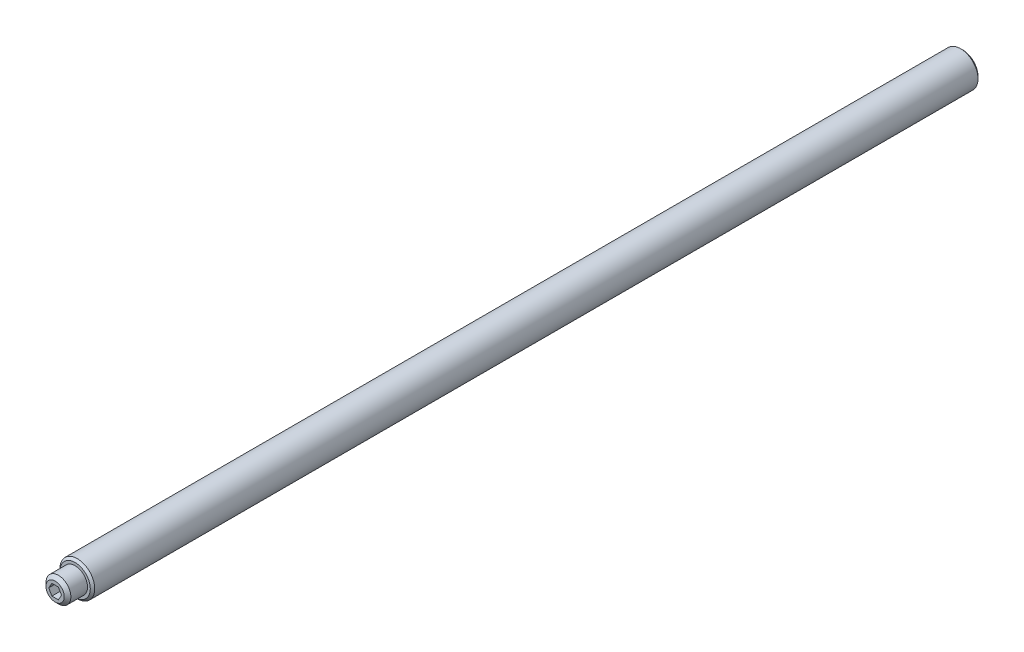
ISO-10303-21;
HEADER;
FILE_DESCRIPTION(('STEP AP214'),'2;1');
FILE_NAME('part.step','',(''),(''),'','','');
FILE_SCHEMA(('AUTOMOTIVE_DESIGN { 1 0 10303 214 1 1 1 1 }'));
ENDSEC;
DATA;
#1=APPLICATION_CONTEXT('core data for automotive mechanical design processes');
#2=APPLICATION_PROTOCOL_DEFINITION('international standard','automotive_design',2000,#1);
#3=PRODUCT_CONTEXT('',#1,'mechanical');
#4=PRODUCT('Part','Part','',(#3));
#5=PRODUCT_RELATED_PRODUCT_CATEGORY('part','',(#4));
#6=PRODUCT_DEFINITION_FORMATION('','',#4);
#7=PRODUCT_DEFINITION_CONTEXT('part definition',#1,'design');
#8=PRODUCT_DEFINITION('design','',#6,#7);
#9=PRODUCT_DEFINITION_SHAPE('','',#8);
#10=(LENGTH_UNIT() NAMED_UNIT(*) SI_UNIT(.MILLI.,.METRE.));
#11=(NAMED_UNIT(*) PLANE_ANGLE_UNIT() SI_UNIT($,.RADIAN.));
#12=(NAMED_UNIT(*) SI_UNIT($,.STERADIAN.) SOLID_ANGLE_UNIT());
#13=UNCERTAINTY_MEASURE_WITH_UNIT(LENGTH_MEASURE(1.E-05),#10,'distance_accuracy_value','');
#14=(GEOMETRIC_REPRESENTATION_CONTEXT(3) GLOBAL_UNCERTAINTY_ASSIGNED_CONTEXT((#13)) GLOBAL_UNIT_ASSIGNED_CONTEXT((#10,
#11,#12)) REPRESENTATION_CONTEXT('',''));
#15=CARTESIAN_POINT('',(0.,0.,0.));
#16=DIRECTION('',(0.,0.,1.));
#17=DIRECTION('',(1.,0.,0.));
#18=AXIS2_PLACEMENT_3D('',#15,#16,#17);
#19=CARTESIAN_POINT('',(0.,0.,50.8));
#20=DIRECTION('',(0.,0.,-1.));
#21=DIRECTION('',(-1.,0.,0.));
#22=AXIS2_PLACEMENT_3D('',#19,#20,#21);
#23=CYLINDRICAL_SURFACE('',#22,1.9939);
#24=CARTESIAN_POINT('',(0.,0.,-50.546));
#25=DIRECTION('',(0.,0.,1.));
#26=DIRECTION('',(1.,0.,0.));
#27=AXIS2_PLACEMENT_3D('',#24,#25,#26);
#28=CIRCLE('',#27,1.9939);
#29=CARTESIAN_POINT('',(1.9939,0.,-50.546));
#30=VERTEX_POINT('',#29);
#31=EDGE_CURVE('P0_E25',#30,#30,#28,.T.);
#32=ORIENTED_EDGE('',*,*,#31,.T.);
#33=EDGE_LOOP('',(#32));
#34=FACE_BOUND('',#33,.T.);
#35=CARTESIAN_POINT('',(0.,0.,50.546));
#36=DIRECTION('',(0.,0.,1.));
#37=DIRECTION('',(1.,0.,0.));
#38=AXIS2_PLACEMENT_3D('',#35,#36,#37);
#39=CIRCLE('',#38,1.9939);
#40=CARTESIAN_POINT('',(1.9939,0.,50.546));
#41=VERTEX_POINT('',#40);
#42=EDGE_CURVE('P0_E66',#41,#41,#39,.F.);
#43=ORIENTED_EDGE('',*,*,#42,.T.);
#44=EDGE_LOOP('',(#43));
#45=FACE_BOUND('',#44,.T.);
#46=ADVANCED_FACE('P0_F17',(#34,#45),#23,.T.);
#47=CARTESIAN_POINT('',(0.,0.,50.8));
#48=DIRECTION('',(0.,0.,1.));
#49=DIRECTION('',(1.,0.,0.));
#50=AXIS2_PLACEMENT_3D('',#47,#48,#49);
#51=PLANE('',#50);
#52=CARTESIAN_POINT('',(0.,0.,50.8));
#53=DIRECTION('',(0.,0.,1.));
#54=DIRECTION('',(1.,0.,0.));
#55=AXIS2_PLACEMENT_3D('',#52,#53,#54);
#56=CIRCLE('',#55,1.42239999999999);
#57=CARTESIAN_POINT('',(1.42239999999999,0.,50.8));
#58=VERTEX_POINT('',#57);
#59=EDGE_CURVE('P0_E60',#58,#58,#56,.T.);
#60=ORIENTED_EDGE('',*,*,#59,.F.);
#61=EDGE_LOOP('',(#60));
#62=FACE_BOUND('',#61,.T.);
#63=CARTESIAN_POINT('',(0.,0.,50.8));
#64=DIRECTION('',(0.,0.,1.));
#65=DIRECTION('',(1.,0.,0.));
#66=AXIS2_PLACEMENT_3D('',#63,#64,#65);
#67=CIRCLE('',#66,1.73989999999999);
#68=CARTESIAN_POINT('',(1.73989999999999,0.,50.8));
#69=VERTEX_POINT('',#68);
#70=EDGE_CURVE('P0_E63',#69,#69,#67,.T.);
#71=ORIENTED_EDGE('',*,*,#70,.T.);
#72=EDGE_LOOP('',(#71));
#73=FACE_BOUND('',#72,.T.);
#74=ADVANCED_FACE('P0_F89',(#62,#73),#51,.T.);
#75=CARTESIAN_POINT('',(0.,0.,-50.8));
#76=DIRECTION('',(0.,0.,1.));
#77=DIRECTION('',(1.,0.,0.));
#78=AXIS2_PLACEMENT_3D('',#75,#76,#77);
#79=PLANE('',#78);
#80=CARTESIAN_POINT('',(0.,0.,-50.8));
#81=DIRECTION('',(0.,0.,-1.));
#82=DIRECTION('',(-1.,0.,0.));
#83=AXIS2_PLACEMENT_3D('',#80,#81,#82);
#84=CIRCLE('',#83,1.42239999999999);
#85=CARTESIAN_POINT('',(-1.42239999999999,0.,-50.8));
#86=VERTEX_POINT('',#85);
#87=EDGE_CURVE('P0_E48',#86,#86,#84,.T.);
#88=ORIENTED_EDGE('',*,*,#87,.F.);
#89=EDGE_LOOP('',(#88));
#90=FACE_BOUND('',#89,.T.);
#91=CARTESIAN_POINT('',(0.,0.,-50.8));
#92=DIRECTION('',(0.,0.,1.));
#93=DIRECTION('',(1.,0.,0.));
#94=AXIS2_PLACEMENT_3D('',#91,#92,#93);
#95=CIRCLE('',#94,1.73990000000002);
#96=CARTESIAN_POINT('',(1.73990000000002,0.,-50.8));
#97=VERTEX_POINT('',#96);
#98=EDGE_CURVE('P0_E11',#97,#97,#95,.F.);
#99=ORIENTED_EDGE('',*,*,#98,.T.);
#100=EDGE_LOOP('',(#99));
#101=FACE_BOUND('',#100,.T.);
#102=ADVANCED_FACE('P0_F85',(#90,#101),#79,.F.);
#103=CARTESIAN_POINT('',(0.,0.,50.8));
#104=DIRECTION('',(0.,0.,-1.));
#105=DIRECTION('',(-1.,0.,0.));
#106=AXIS2_PLACEMENT_3D('',#103,#104,#105);
#107=CONICAL_SURFACE('',#106,1.73989999999999,0.785398163397462);
#108=ORIENTED_EDGE('',*,*,#42,.F.);
#109=EDGE_LOOP('',(#108));
#110=FACE_BOUND('',#109,.T.);
#111=ORIENTED_EDGE('',*,*,#70,.F.);
#112=EDGE_LOOP('',(#111));
#113=FACE_BOUND('',#112,.T.);
#114=ADVANCED_FACE('P0_F75',(#110,#113),#107,.T.);
#115=CARTESIAN_POINT('',(0.,0.,-50.546));
#116=DIRECTION('',(0.,0.,1.));
#117=DIRECTION('',(1.,0.,0.));
#118=AXIS2_PLACEMENT_3D('',#115,#116,#117);
#119=CONICAL_SURFACE('',#118,1.9939,0.785398163397435);
#120=ORIENTED_EDGE('',*,*,#98,.F.);
#121=EDGE_LOOP('',(#120));
#122=FACE_BOUND('',#121,.T.);
#123=ORIENTED_EDGE('',*,*,#31,.F.);
#124=EDGE_LOOP('',(#123));
#125=FACE_BOUND('',#124,.T.);
#126=ADVANCED_FACE('P0_F19',(#122,#125),#119,.T.);
#127=CARTESIAN_POINT('',(0.,0.,50.8));
#128=DIRECTION('',(0.,0.,1.));
#129=DIRECTION('',(1.,0.,0.));
#130=AXIS2_PLACEMENT_3D('',#127,#128,#129);
#131=CYLINDRICAL_SURFACE('',#130,1.4224);
#132=CARTESIAN_POINT('',(0.,0.,46.736));
#133=DIRECTION('',(0.,0.,1.));
#134=DIRECTION('',(1.,0.,0.));
#135=AXIS2_PLACEMENT_3D('',#132,#133,#134);
#136=CIRCLE('',#135,1.4224);
#137=CARTESIAN_POINT('',(1.4224,0.,46.736));
#138=VERTEX_POINT('',#137);
#139=EDGE_CURVE('P0_E57',#138,#138,#136,.T.);
#140=ORIENTED_EDGE('',*,*,#139,.F.);
#141=EDGE_LOOP('',(#140));
#142=FACE_BOUND('',#141,.T.);
#143=ORIENTED_EDGE('',*,*,#59,.T.);
#144=EDGE_LOOP('',(#143));
#145=FACE_BOUND('',#144,.T.);
#146=ADVANCED_FACE('P0_F74',(#142,#145),#131,.F.);
#147=CARTESIAN_POINT('',(1.1303,0.,46.736));
#148=DIRECTION('',(0.,0.,-1.));
#149=DIRECTION('',(-1.,0.,0.));
#150=AXIS2_PLACEMENT_3D('',#147,#148,#149);
#151=PLANE('',#150);
#152=CARTESIAN_POINT('',(0.,0.,46.736));
#153=DIRECTION('',(0.,0.,1.));
#154=DIRECTION('',(1.,0.,0.));
#155=AXIS2_PLACEMENT_3D('',#152,#153,#154);
#156=CIRCLE('',#155,1.1303);
#157=CARTESIAN_POINT('',(1.1303,0.,46.736));
#158=VERTEX_POINT('',#157);
#159=EDGE_CURVE('P0_E54',#158,#158,#156,.T.);
#160=ORIENTED_EDGE('',*,*,#159,.F.);
#161=EDGE_LOOP('',(#160));
#162=FACE_BOUND('',#161,.T.);
#163=ORIENTED_EDGE('',*,*,#139,.T.);
#164=EDGE_LOOP('',(#163));
#165=FACE_BOUND('',#164,.T.);
#166=ADVANCED_FACE('P0_F82',(#162,#165),#151,.F.);
#167=CARTESIAN_POINT('',(0.,0.,50.8));
#168=DIRECTION('',(0.,0.,1.));
#169=DIRECTION('',(1.,0.,0.));
#170=AXIS2_PLACEMENT_3D('',#167,#168,#169);
#171=CYLINDRICAL_SURFACE('',#170,1.1303);
#172=CARTESIAN_POINT('',(0.,0.,45.72));
#173=DIRECTION('',(0.,0.,1.));
#174=DIRECTION('',(1.,0.,0.));
#175=AXIS2_PLACEMENT_3D('',#172,#173,#174);
#176=CIRCLE('',#175,1.1303);
#177=CARTESIAN_POINT('',(1.1303,0.,45.72));
#178=VERTEX_POINT('',#177);
#179=EDGE_CURVE('P0_E51',#178,#178,#176,.T.);
#180=ORIENTED_EDGE('',*,*,#179,.F.);
#181=EDGE_LOOP('',(#180));
#182=FACE_BOUND('',#181,.T.);
#183=ORIENTED_EDGE('',*,*,#159,.T.);
#184=EDGE_LOOP('',(#183));
#185=FACE_BOUND('',#184,.T.);
#186=ADVANCED_FACE('P0_F102',(#182,#185),#171,.F.);
#187=CARTESIAN_POINT('',(0.,0.,45.72));
#188=DIRECTION('',(0.,0.,1.));
#189=DIRECTION('',(1.,0.,0.));
#190=AXIS2_PLACEMENT_3D('',#187,#188,#189);
#191=CONICAL_SURFACE('',#190,1.1303,1.02974425867665);
#192=CARTESIAN_POINT('',(0.,0.,45.0408472423131));
#193=VERTEX_POINT('',#192);
#194=VERTEX_LOOP('',#193);
#195=FACE_BOUND('',#194,.T.);
#196=ORIENTED_EDGE('',*,*,#179,.T.);
#197=EDGE_LOOP('',(#196));
#198=FACE_BOUND('',#197,.T.);
#199=ADVANCED_FACE('P0_F106',(#195,#198),#191,.F.);
#200=CARTESIAN_POINT('',(0.,0.,-50.8));
#201=DIRECTION('',(0.,0.,-1.));
#202=DIRECTION('',(-1.,0.,0.));
#203=AXIS2_PLACEMENT_3D('',#200,#201,#202);
#204=CYLINDRICAL_SURFACE('',#203,1.4224);
#205=CARTESIAN_POINT('',(0.,0.,-46.736));
#206=DIRECTION('',(0.,0.,-1.));
#207=DIRECTION('',(-1.,0.,0.));
#208=AXIS2_PLACEMENT_3D('',#205,#206,#207);
#209=CIRCLE('',#208,1.4224);
#210=CARTESIAN_POINT('',(-1.4224,0.,-46.736));
#211=VERTEX_POINT('',#210);
#212=EDGE_CURVE('P0_E43',#211,#211,#209,.T.);
#213=ORIENTED_EDGE('',*,*,#212,.F.);
#214=EDGE_LOOP('',(#213));
#215=FACE_BOUND('',#214,.T.);
#216=ORIENTED_EDGE('',*,*,#87,.T.);
#217=EDGE_LOOP('',(#216));
#218=FACE_BOUND('',#217,.T.);
#219=ADVANCED_FACE('P0_F110',(#215,#218),#204,.F.);
#220=CARTESIAN_POINT('',(1.1303,0.,-46.736));
#221=DIRECTION('',(0.,0.,1.));
#222=DIRECTION('',(1.,0.,0.));
#223=AXIS2_PLACEMENT_3D('',#220,#221,#222);
#224=PLANE('',#223);
#225=CARTESIAN_POINT('',(0.,0.,-46.736));
#226=DIRECTION('',(0.,0.,-1.));
#227=DIRECTION('',(-1.,0.,0.));
#228=AXIS2_PLACEMENT_3D('',#225,#226,#227);
#229=CIRCLE('',#228,1.1303);
#230=CARTESIAN_POINT('',(-1.1303,0.,-46.736));
#231=VERTEX_POINT('',#230);
#232=EDGE_CURVE('P0_E40',#231,#231,#229,.T.);
#233=ORIENTED_EDGE('',*,*,#232,.F.);
#234=EDGE_LOOP('',(#233));
#235=FACE_BOUND('',#234,.T.);
#236=ORIENTED_EDGE('',*,*,#212,.T.);
#237=EDGE_LOOP('',(#236));
#238=FACE_BOUND('',#237,.T.);
#239=ADVANCED_FACE('P0_F113',(#235,#238),#224,.F.);
#240=CARTESIAN_POINT('',(0.,0.,-50.8));
#241=DIRECTION('',(0.,0.,-1.));
#242=DIRECTION('',(-1.,0.,0.));
#243=AXIS2_PLACEMENT_3D('',#240,#241,#242);
#244=CYLINDRICAL_SURFACE('',#243,1.1303);
#245=CARTESIAN_POINT('',(0.,0.,-45.72));
#246=DIRECTION('',(0.,0.,-1.));
#247=DIRECTION('',(-1.,0.,0.));
#248=AXIS2_PLACEMENT_3D('',#245,#246,#247);
#249=CIRCLE('',#248,1.1303);
#250=CARTESIAN_POINT('',(-1.1303,0.,-45.72));
#251=VERTEX_POINT('',#250);
#252=EDGE_CURVE('P0_E38',#251,#251,#249,.T.);
#253=ORIENTED_EDGE('',*,*,#252,.F.);
#254=EDGE_LOOP('',(#253));
#255=FACE_BOUND('',#254,.T.);
#256=ORIENTED_EDGE('',*,*,#232,.T.);
#257=EDGE_LOOP('',(#256));
#258=FACE_BOUND('',#257,.T.);
#259=ADVANCED_FACE('P0_F34',(#255,#258),#244,.F.);
#260=CARTESIAN_POINT('',(0.,0.,-45.72));
#261=DIRECTION('',(0.,0.,-1.));
#262=DIRECTION('',(-1.,0.,0.));
#263=AXIS2_PLACEMENT_3D('',#260,#261,#262);
#264=CONICAL_SURFACE('',#263,1.1303,1.02974425867665);
#265=CARTESIAN_POINT('',(0.,0.,-45.0408472423131));
#266=VERTEX_POINT('',#265);
#267=VERTEX_LOOP('',#266);
#268=FACE_BOUND('',#267,.T.);
#269=ORIENTED_EDGE('',*,*,#252,.T.);
#270=EDGE_LOOP('',(#269));
#271=FACE_BOUND('',#270,.T.);
#272=ADVANCED_FACE('P0_F31',(#268,#271),#264,.F.);
#273=CLOSED_SHELL('',(#46,#74,#102,#114,#126,#146,#166,#186,#199,#219,#239,#259,#272));
#274=MANIFOLD_SOLID_BREP('P0_B1',#273);
#275=CARTESIAN_POINT('',(0.,0.,53.086));
#276=DIRECTION('',(0.,0.,1.));
#277=DIRECTION('',(0.999997633023904,-0.00217576344970809,0.));
#278=AXIS2_PLACEMENT_3D('',#275,#276,#277);
#279=PLANE('',#278);
#280=CARTESIAN_POINT('',(0.,0.,53.086));
#281=DIRECTION('',(0.,0.,1.));
#282=DIRECTION('',(0.999997633023904,-0.00217576344970809,0.));
#283=AXIS2_PLACEMENT_3D('',#280,#281,#282);
#284=CIRCLE('',#283,1.04394);
#285=CARTESIAN_POINT('',(1.04393752901897,-0.00227136649568899,53.086));
#286=VERTEX_POINT('',#285);
#287=EDGE_CURVE('P1_E11',#286,#286,#284,.T.);
#288=ORIENTED_EDGE('',*,*,#287,.T.);
#289=EDGE_LOOP('',(#288));
#290=FACE_BOUND('',#289,.T.);
#291=DIRECTION('',(-0.999997633023904,0.00217576344970794,0.));
#292=VECTOR('',#291,1.);
#293=CARTESIAN_POINT('',(0.367998162951304,0.634200824185685,53.086));
#294=LINE('',#293,#292);
#295=CARTESIAN_POINT('',(0.367998162951304,0.634200824185685,53.086));
#296=VERTEX_POINT('',#295);
#297=CARTESIAN_POINT('',(-0.365234943370178,0.63579616975468,53.086));
#298=VERTEX_POINT('',#297);
#299=EDGE_CURVE('P1_E78',#296,#298,#294,.T.);
#300=ORIENTED_EDGE('',*,*,#299,.F.);
#301=DIRECTION('',(0.49811455009188,-0.867111235647864,0.));
#302=VECTOR('',#301,1.);
#303=CARTESIAN_POINT('',(0.367998162951304,0.634200824185685,53.086));
#304=LINE('',#303,#302);
#305=CARTESIAN_POINT('',(0.73323310632148,-0.00159534556899138,53.086));
#306=VERTEX_POINT('',#305);
#307=EDGE_CURVE('P1_E31',#296,#306,#304,.T.);
#308=ORIENTED_EDGE('',*,*,#307,.T.);
#309=DIRECTION('',(0.501883082932025,0.864935472198155,0.));
#310=VECTOR('',#309,1.);
#311=CARTESIAN_POINT('',(0.365234943370175,-0.635796169754673,53.086));
#312=LINE('',#311,#310);
#313=CARTESIAN_POINT('',(0.365234943370175,-0.635796169754673,53.086));
#314=VERTEX_POINT('',#313);
#315=EDGE_CURVE('P1_E84',#314,#306,#312,.T.);
#316=ORIENTED_EDGE('',*,*,#315,.F.);
#317=DIRECTION('',(-0.999997633023904,0.00217576344970809,0.));
#318=VECTOR('',#317,1.);
#319=CARTESIAN_POINT('',(0.365234943370175,-0.635796169754673,53.086));
#320=LINE('',#319,#318);
#321=CARTESIAN_POINT('',(-0.367998162951307,-0.634200824185678,53.086));
#322=VERTEX_POINT('',#321);
#323=EDGE_CURVE('P1_E104',#314,#322,#320,.T.);
#324=ORIENTED_EDGE('',*,*,#323,.T.);
#325=DIRECTION('',(-0.498114550091879,0.867111235647864,0.));
#326=VECTOR('',#325,1.);
#327=CARTESIAN_POINT('',(-0.367998162951307,-0.634200824185678,53.086));
#328=LINE('',#327,#326);
#329=CARTESIAN_POINT('',(-0.733233106321483,0.00159534556899851,53.086));
#330=VERTEX_POINT('',#329);
#331=EDGE_CURVE('P1_E107',#322,#330,#328,.T.);
#332=ORIENTED_EDGE('',*,*,#331,.T.);
#333=DIRECTION('',(-0.501883082932025,-0.864935472198155,0.));
#334=VECTOR('',#333,1.);
#335=CARTESIAN_POINT('',(-0.365234943370178,0.63579616975468,53.086));
#336=LINE('',#335,#334);
#337=EDGE_CURVE('P1_E110',#298,#330,#336,.T.);
#338=ORIENTED_EDGE('',*,*,#337,.F.);
#339=EDGE_LOOP('',(#300,#308,#316,#324,#332,#338));
#340=FACE_BOUND('',#339,.T.);
#341=ADVANCED_FACE('P1_F17',(#290,#340),#279,.T.);
#342=CARTESIAN_POINT('',(0.,0.,53.086));
#343=DIRECTION('',(0.,0.,-1.));
#344=DIRECTION('',(-0.999997633023904,0.00217576344970809,0.));
#345=AXIS2_PLACEMENT_3D('',#342,#343,#344);
#346=CONICAL_SURFACE('',#345,1.04394,0.785398163397426);
#347=CARTESIAN_POINT('',(0.,0.,52.70754));
#348=DIRECTION('',(0.,0.,1.));
#349=DIRECTION('',(0.999997633023904,-0.00217576344970809,0.));
#350=AXIS2_PLACEMENT_3D('',#347,#348,#349);
#351=CIRCLE('',#350,1.4224);
#352=CARTESIAN_POINT('',(1.4223966332132,-0.00309480593086552,52.70754));
#353=VERTEX_POINT('',#352);
#354=EDGE_CURVE('P1_E24',#353,#353,#351,.T.);
#355=ORIENTED_EDGE('',*,*,#354,.T.);
#356=EDGE_LOOP('',(#355));
#357=FACE_BOUND('',#356,.T.);
#358=ORIENTED_EDGE('',*,*,#287,.F.);
#359=EDGE_LOOP('',(#358));
#360=FACE_BOUND('',#359,.T.);
#361=ADVANCED_FACE('P1_F130',(#357,#360),#346,.T.);
#362=CARTESIAN_POINT('',(0.,0.,65.786));
#363=DIRECTION('',(0.,0.,1.));
#364=DIRECTION('',(0.999997633023904,-0.00217576344970809,0.));
#365=AXIS2_PLACEMENT_3D('',#362,#363,#364);
#366=CYLINDRICAL_SURFACE('',#365,1.4224);
#367=CARTESIAN_POINT('',(0.,0.,47.3837));
#368=DIRECTION('',(0.,0.,1.));
#369=DIRECTION('',(0.999997633023904,-0.00217576344970809,0.));
#370=AXIS2_PLACEMENT_3D('',#367,#368,#369);
#371=CIRCLE('',#370,1.4224);
#372=CARTESIAN_POINT('',(1.4223966332132,-0.00309480593086552,47.3837));
#373=VERTEX_POINT('',#372);
#374=EDGE_CURVE('P1_E125',#373,#373,#371,.T.);
#375=ORIENTED_EDGE('',*,*,#374,.T.);
#376=EDGE_LOOP('',(#375));
#377=FACE_BOUND('',#376,.T.);
#378=ORIENTED_EDGE('',*,*,#354,.F.);
#379=EDGE_LOOP('',(#378));
#380=FACE_BOUND('',#379,.T.);
#381=ADVANCED_FACE('P1_F133',(#377,#380),#366,.T.);
#382=CARTESIAN_POINT('',(0.,0.,47.3837));
#383=DIRECTION('',(0.,0.,1.));
#384=DIRECTION('',(0.999997633023904,-0.00217576344970809,0.));
#385=AXIS2_PLACEMENT_3D('',#382,#383,#384);
#386=CONICAL_SURFACE('',#385,1.4224,0.785398163397453);
#387=CARTESIAN_POINT('',(0.,0.,46.736));
#388=DIRECTION('',(0.,0.,1.));
#389=DIRECTION('',(0.999997633023904,-0.00217576344970809,0.));
#390=AXIS2_PLACEMENT_3D('',#387,#388,#389);
#391=CIRCLE('',#390,0.7747);
#392=CARTESIAN_POINT('',(0.774698166303616,-0.00168556394448959,46.736));
#393=VERTEX_POINT('',#392);
#394=EDGE_CURVE('P1_E85',#393,#393,#391,.T.);
#395=ORIENTED_EDGE('',*,*,#394,.T.);
#396=EDGE_LOOP('',(#395));
#397=FACE_BOUND('',#396,.T.);
#398=ORIENTED_EDGE('',*,*,#374,.F.);
#399=EDGE_LOOP('',(#398));
#400=FACE_BOUND('',#399,.T.);
#401=ADVANCED_FACE('P1_F135',(#397,#400),#386,.T.);
#402=CARTESIAN_POINT('',(0.,0.,47.2014867215606));
#403=DIRECTION('',(0.,0.,-1.));
#404=DIRECTION('',(-0.999997633023904,0.00217576344970809,0.));
#405=AXIS2_PLACEMENT_3D('',#402,#403,#404);
#406=CONICAL_SURFACE('',#405,0.,1.02974425867666);
#407=ORIENTED_EDGE('',*,*,#394,.F.);
#408=EDGE_LOOP('',(#407));
#409=FACE_BOUND('',#408,.T.);
#410=CARTESIAN_POINT('',(0.,0.,47.2014867215606));
#411=VERTEX_POINT('',#410);
#412=VERTEX_LOOP('',#411);
#413=FACE_BOUND('',#412,.T.);
#414=ADVANCED_FACE('P1_F143',(#409,#413),#406,.F.);
#415=CARTESIAN_POINT('',(0.367998162951304,0.634200824185685,51.308));
#416=DIRECTION('',(-0.867111235647863,-0.498114550091879,0.));
#417=DIRECTION('',(-0.49811455009188,0.867111235647864,0.));
#418=AXIS2_PLACEMENT_3D('',#415,#416,#417);
#419=PLANE('',#418);
#420=ORIENTED_EDGE('',*,*,#307,.F.);
#421=DIRECTION('',(0.,0.,1.));
#422=VECTOR('',#421,1.);
#423=CARTESIAN_POINT('',(0.367998162951304,0.634200824185685,51.308));
#424=LINE('',#423,#422);
#425=CARTESIAN_POINT('',(0.367998162951304,0.634200824185685,51.308));
#426=VERTEX_POINT('',#425);
#427=EDGE_CURVE('P1_E72',#426,#296,#424,.T.);
#428=ORIENTED_EDGE('',*,*,#427,.F.);
#429=DIRECTION('',(0.49811455009188,-0.867111235647864,0.));
#430=VECTOR('',#429,1.);
#431=CARTESIAN_POINT('',(0.367998162951304,0.634200824185685,51.308));
#432=LINE('',#431,#430);
#433=CARTESIAN_POINT('',(0.73323310632148,-0.00159534556899138,51.308));
#434=VERTEX_POINT('',#433);
#435=EDGE_CURVE('P1_E67',#426,#434,#432,.T.);
#436=ORIENTED_EDGE('',*,*,#435,.T.);
#437=DIRECTION('',(0.,0.,1.));
#438=VECTOR('',#437,1.);
#439=CARTESIAN_POINT('',(0.73323310632148,-0.00159534556899138,51.308));
#440=LINE('',#439,#438);
#441=EDGE_CURVE('P1_E70',#434,#306,#440,.T.);
#442=ORIENTED_EDGE('',*,*,#441,.T.);
#443=EDGE_LOOP('',(#420,#428,#436,#442));
#444=FACE_BOUND('',#443,.T.);
#445=ADVANCED_FACE('P1_F69',(#444),#419,.T.);
#446=CARTESIAN_POINT('',(0.365234943370174,-0.635796169754673,51.308));
#447=DIRECTION('',(0.864935472198155,-0.501883082932025,0.));
#448=DIRECTION('',(-0.501883082932025,-0.864935472198155,0.));
#449=AXIS2_PLACEMENT_3D('',#446,#447,#448);
#450=PLANE('',#449);
#451=ORIENTED_EDGE('',*,*,#315,.T.);
#452=ORIENTED_EDGE('',*,*,#441,.F.);
#453=DIRECTION('',(0.501883082932025,0.864935472198155,0.));
#454=VECTOR('',#453,1.);
#455=CARTESIAN_POINT('',(0.365234943370174,-0.635796169754673,51.308));
#456=LINE('',#455,#454);
#457=CARTESIAN_POINT('',(0.365234943370174,-0.635796169754673,51.308));
#458=VERTEX_POINT('',#457);
#459=EDGE_CURVE('P1_E77',#458,#434,#456,.T.);
#460=ORIENTED_EDGE('',*,*,#459,.F.);
#461=DIRECTION('',(0.,0.,1.));
#462=VECTOR('',#461,1.);
#463=CARTESIAN_POINT('',(0.365234943370174,-0.635796169754673,51.308));
#464=LINE('',#463,#462);
#465=EDGE_CURVE('P1_E86',#458,#314,#464,.T.);
#466=ORIENTED_EDGE('',*,*,#465,.T.);
#467=EDGE_LOOP('',(#451,#452,#460,#466));
#468=FACE_BOUND('',#467,.T.);
#469=ADVANCED_FACE('P1_F82',(#468),#450,.F.);
#470=CARTESIAN_POINT('',(0.365234943370174,-0.635796169754673,51.308));
#471=DIRECTION('',(0.00217576344970802,0.999997633023904,0.));
#472=DIRECTION('',(0.999997633023904,-0.00217576344970809,0.));
#473=AXIS2_PLACEMENT_3D('',#470,#471,#472);
#474=PLANE('',#473);
#475=ORIENTED_EDGE('',*,*,#323,.F.);
#476=ORIENTED_EDGE('',*,*,#465,.F.);
#477=DIRECTION('',(-0.999997633023904,0.00217576344970809,0.));
#478=VECTOR('',#477,1.);
#479=CARTESIAN_POINT('',(0.365234943370174,-0.635796169754673,51.308));
#480=LINE('',#479,#478);
#481=CARTESIAN_POINT('',(-0.367998162951307,-0.634200824185678,51.308));
#482=VERTEX_POINT('',#481);
#483=EDGE_CURVE('P1_E91',#458,#482,#480,.T.);
#484=ORIENTED_EDGE('',*,*,#483,.T.);
#485=DIRECTION('',(0.,0.,1.));
#486=VECTOR('',#485,1.);
#487=CARTESIAN_POINT('',(-0.367998162951307,-0.634200824185678,51.308));
#488=LINE('',#487,#486);
#489=EDGE_CURVE('P1_E120',#482,#322,#488,.T.);
#490=ORIENTED_EDGE('',*,*,#489,.T.);
#491=EDGE_LOOP('',(#475,#476,#484,#490));
#492=FACE_BOUND('',#491,.T.);
#493=ADVANCED_FACE('P1_F166',(#492),#474,.T.);
#494=CARTESIAN_POINT('',(-0.367998162951307,-0.634200824185678,51.308));
#495=DIRECTION('',(0.867111235647864,0.498114550091879,0.));
#496=DIRECTION('',(0.498114550091879,-0.867111235647864,0.));
#497=AXIS2_PLACEMENT_3D('',#494,#495,#496);
#498=PLANE('',#497);
#499=ORIENTED_EDGE('',*,*,#331,.F.);
#500=ORIENTED_EDGE('',*,*,#489,.F.);
#501=DIRECTION('',(-0.498114550091879,0.867111235647864,0.));
#502=VECTOR('',#501,1.);
#503=CARTESIAN_POINT('',(-0.367998162951307,-0.634200824185678,51.308));
#504=LINE('',#503,#502);
#505=CARTESIAN_POINT('',(-0.733233106321483,0.00159534556899851,51.308));
#506=VERTEX_POINT('',#505);
#507=EDGE_CURVE('P1_E93',#482,#506,#504,.T.);
#508=ORIENTED_EDGE('',*,*,#507,.T.);
#509=DIRECTION('',(0.,0.,1.));
#510=VECTOR('',#509,1.);
#511=CARTESIAN_POINT('',(-0.733233106321483,0.00159534556899851,51.308));
#512=LINE('',#511,#510);
#513=EDGE_CURVE('P1_E118',#506,#330,#512,.T.);
#514=ORIENTED_EDGE('',*,*,#513,.T.);
#515=EDGE_LOOP('',(#499,#500,#508,#514));
#516=FACE_BOUND('',#515,.T.);
#517=ADVANCED_FACE('P1_F162',(#516),#498,.T.);
#518=CARTESIAN_POINT('',(-0.365234943370178,0.63579616975468,51.308));
#519=DIRECTION('',(-0.864935472198156,0.501883082932025,0.));
#520=DIRECTION('',(0.501883082932025,0.864935472198155,0.));
#521=AXIS2_PLACEMENT_3D('',#518,#519,#520);
#522=PLANE('',#521);
#523=ORIENTED_EDGE('',*,*,#337,.T.);
#524=ORIENTED_EDGE('',*,*,#513,.F.);
#525=DIRECTION('',(-0.501883082932025,-0.864935472198155,0.));
#526=VECTOR('',#525,1.);
#527=CARTESIAN_POINT('',(-0.365234943370178,0.63579616975468,51.308));
#528=LINE('',#527,#526);
#529=CARTESIAN_POINT('',(-0.365234943370178,0.63579616975468,51.308));
#530=VERTEX_POINT('',#529);
#531=EDGE_CURVE('P1_E97',#530,#506,#528,.T.);
#532=ORIENTED_EDGE('',*,*,#531,.F.);
#533=DIRECTION('',(0.,0.,1.));
#534=VECTOR('',#533,1.);
#535=CARTESIAN_POINT('',(-0.365234943370178,0.63579616975468,51.308));
#536=LINE('',#535,#534);
#537=EDGE_CURVE('P1_E116',#530,#298,#536,.T.);
#538=ORIENTED_EDGE('',*,*,#537,.T.);
#539=EDGE_LOOP('',(#523,#524,#532,#538));
#540=FACE_BOUND('',#539,.T.);
#541=ADVANCED_FACE('P1_F159',(#540),#522,.F.);
#542=CARTESIAN_POINT('',(0.367998162951304,0.634200824185685,51.308));
#543=DIRECTION('',(0.00217576344970787,0.999997633023904,0.));
#544=DIRECTION('',(0.999997633023904,-0.00217576344970794,0.));
#545=AXIS2_PLACEMENT_3D('',#542,#543,#544);
#546=PLANE('',#545);
#547=ORIENTED_EDGE('',*,*,#299,.T.);
#548=ORIENTED_EDGE('',*,*,#537,.F.);
#549=DIRECTION('',(-0.999997633023904,0.00217576344970794,0.));
#550=VECTOR('',#549,1.);
#551=CARTESIAN_POINT('',(0.367998162951304,0.634200824185685,51.308));
#552=LINE('',#551,#550);
#553=EDGE_CURVE('P1_E100',#426,#530,#552,.T.);
#554=ORIENTED_EDGE('',*,*,#553,.F.);
#555=ORIENTED_EDGE('',*,*,#427,.T.);
#556=EDGE_LOOP('',(#547,#548,#554,#555));
#557=FACE_BOUND('',#556,.T.);
#558=ADVANCED_FACE('P1_F155',(#557),#546,.F.);
#559=CARTESIAN_POINT('',(0.73323310632148,-0.00159534556899132,51.308));
#560=DIRECTION('',(0.,0.,1.));
#561=DIRECTION('',(0.999997633023904,-0.00217576344970809,0.));
#562=AXIS2_PLACEMENT_3D('',#559,#560,#561);
#563=PLANE('',#562);
#564=ORIENTED_EDGE('',*,*,#435,.F.);
#565=ORIENTED_EDGE('',*,*,#553,.T.);
#566=ORIENTED_EDGE('',*,*,#531,.T.);
#567=ORIENTED_EDGE('',*,*,#507,.F.);
#568=ORIENTED_EDGE('',*,*,#483,.F.);
#569=ORIENTED_EDGE('',*,*,#459,.T.);
#570=EDGE_LOOP('',(#564,#565,#566,#567,#568,#569));
#571=FACE_BOUND('',#570,.T.);
#572=ADVANCED_FACE('P1_F89',(#571),#563,.T.);
#573=CLOSED_SHELL('',(#341,#361,#381,#401,#414,#445,#469,#493,#517,#541,#558,#572));
#574=MANIFOLD_SOLID_BREP('P1_B1',#573);
#575=ADVANCED_BREP_SHAPE_REPRESENTATION('',(#18,#274,#574),#14);
#576=SHAPE_DEFINITION_REPRESENTATION(#9,#575);
ENDSEC;
END-ISO-10303-21;
